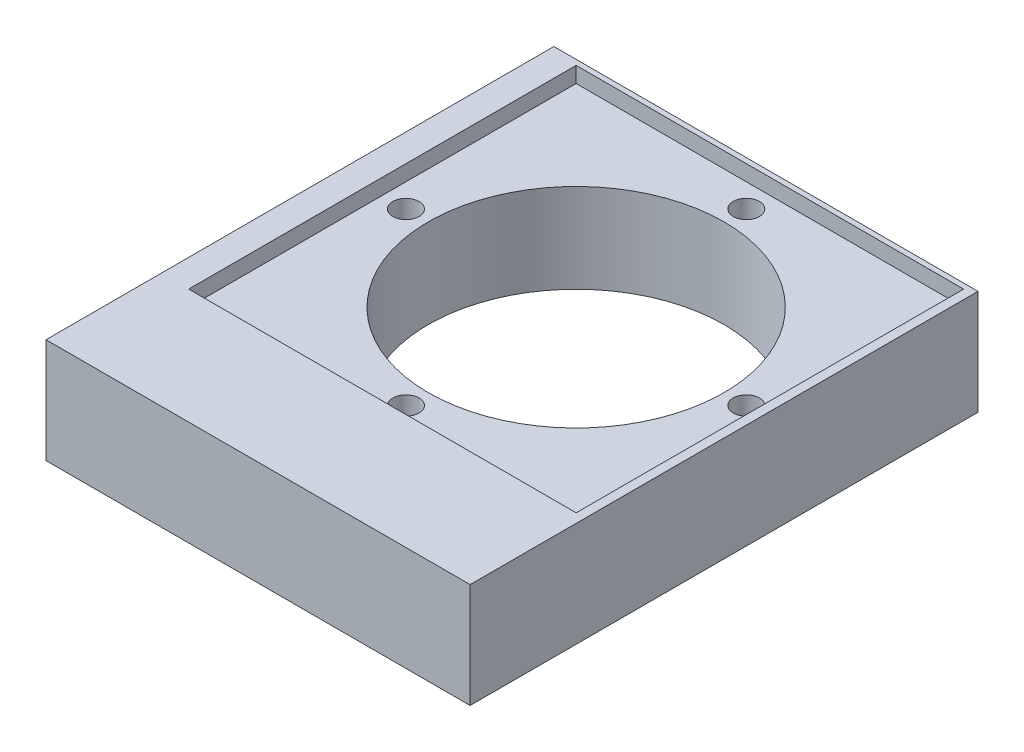
ISO-10303-21;
HEADER;
FILE_DESCRIPTION(('STEP AP214'),'2;1');
FILE_NAME('part.step','',(''),(''),'','','');
FILE_SCHEMA(('AUTOMOTIVE_DESIGN { 1 0 10303 214 1 1 1 1 }'));
ENDSEC;
DATA;
#1=APPLICATION_CONTEXT('core data for automotive mechanical design processes');
#2=APPLICATION_PROTOCOL_DEFINITION('international standard','automotive_design',2000,#1);
#3=PRODUCT_CONTEXT('',#1,'mechanical');
#4=PRODUCT('Part','Part','',(#3));
#5=PRODUCT_RELATED_PRODUCT_CATEGORY('part','',(#4));
#6=PRODUCT_DEFINITION_FORMATION('','',#4);
#7=PRODUCT_DEFINITION_CONTEXT('part definition',#1,'design');
#8=PRODUCT_DEFINITION('design','',#6,#7);
#9=PRODUCT_DEFINITION_SHAPE('','',#8);
#10=(LENGTH_UNIT() NAMED_UNIT(*) SI_UNIT(.MILLI.,.METRE.));
#11=(NAMED_UNIT(*) PLANE_ANGLE_UNIT() SI_UNIT($,.RADIAN.));
#12=(NAMED_UNIT(*) SI_UNIT($,.STERADIAN.) SOLID_ANGLE_UNIT());
#13=UNCERTAINTY_MEASURE_WITH_UNIT(LENGTH_MEASURE(1.E-05),#10,'distance_accuracy_value','');
#14=(GEOMETRIC_REPRESENTATION_CONTEXT(3) GLOBAL_UNCERTAINTY_ASSIGNED_CONTEXT((#13)) GLOBAL_UNIT_ASSIGNED_CONTEXT((#10,
#11,#12)) REPRESENTATION_CONTEXT('',''));
#15=CARTESIAN_POINT('',(0.,0.,0.));
#16=DIRECTION('',(0.,0.,1.));
#17=DIRECTION('',(1.,0.,0.));
#18=AXIS2_PLACEMENT_3D('',#15,#16,#17);
#19=CARTESIAN_POINT('',(1.75,0.,-10.5));
#20=DIRECTION('',(0.,1.,0.));
#21=DIRECTION('',(0.,0.,1.));
#22=AXIS2_PLACEMENT_3D('',#19,#20,#21);
#23=CYLINDRICAL_SURFACE('',#22,28.25);
#24=CARTESIAN_POINT('',(1.75,0.,-10.5));
#25=DIRECTION('',(0.,1.,0.));
#26=DIRECTION('',(0.,0.,1.));
#27=AXIS2_PLACEMENT_3D('',#24,#25,#26);
#28=CIRCLE('',#27,28.25);
#29=CARTESIAN_POINT('',(1.75,0.,17.75));
#30=VERTEX_POINT('',#29);
#31=EDGE_CURVE('E170',#30,#30,#28,.T.);
#32=ORIENTED_EDGE('',*,*,#31,.F.);
#33=EDGE_LOOP('',(#32));
#34=FACE_BOUND('',#33,.T.);
#35=CARTESIAN_POINT('',(1.75,17.,-10.5));
#36=DIRECTION('',(0.,1.,0.));
#37=DIRECTION('',(0.,0.,1.));
#38=AXIS2_PLACEMENT_3D('',#35,#36,#37);
#39=CIRCLE('',#38,28.25);
#40=CARTESIAN_POINT('',(1.75,17.,17.75));
#41=VERTEX_POINT('',#40);
#42=EDGE_CURVE('E43',#41,#41,#39,.F.);
#43=ORIENTED_EDGE('',*,*,#42,.F.);
#44=EDGE_LOOP('',(#43));
#45=FACE_BOUND('',#44,.T.);
#46=ADVANCED_FACE('F39',(#34,#45),#23,.F.);
#47=CARTESIAN_POINT('',(40.5,20.,-48.5));
#48=DIRECTION('',(-1.,0.,0.));
#49=DIRECTION('',(0.,0.,1.));
#50=AXIS2_PLACEMENT_3D('',#47,#48,#49);
#51=PLANE('',#50);
#52=DIRECTION('',(0.,0.,-1.));
#53=VECTOR('',#52,1.);
#54=CARTESIAN_POINT('',(40.5,0.,-48.5));
#55=LINE('',#54,#53);
#56=CARTESIAN_POINT('',(40.5,0.,48.5));
#57=VERTEX_POINT('',#56);
#58=CARTESIAN_POINT('',(40.5,0.,-48.5));
#59=VERTEX_POINT('',#58);
#60=EDGE_CURVE('E174',#57,#59,#55,.T.);
#61=ORIENTED_EDGE('',*,*,#60,.T.);
#62=DIRECTION('',(0.,-1.,0.));
#63=VECTOR('',#62,1.);
#64=CARTESIAN_POINT('',(40.5,20.,-48.5));
#65=LINE('',#64,#63);
#66=CARTESIAN_POINT('',(40.5,20.,-48.5));
#67=VERTEX_POINT('',#66);
#68=EDGE_CURVE('E11',#67,#59,#65,.T.);
#69=ORIENTED_EDGE('',*,*,#68,.F.);
#70=DIRECTION('',(0.,0.,-1.));
#71=VECTOR('',#70,1.);
#72=CARTESIAN_POINT('',(40.5,20.,-48.5));
#73=LINE('',#72,#71);
#74=CARTESIAN_POINT('',(40.5,20.,48.5));
#75=VERTEX_POINT('',#74);
#76=EDGE_CURVE('E175',#75,#67,#73,.T.);
#77=ORIENTED_EDGE('',*,*,#76,.F.);
#78=DIRECTION('',(0.,-1.,0.));
#79=VECTOR('',#78,1.);
#80=CARTESIAN_POINT('',(40.5,20.,48.5));
#81=LINE('',#80,#79);
#82=EDGE_CURVE('E185',#75,#57,#81,.T.);
#83=ORIENTED_EDGE('',*,*,#82,.T.);
#84=EDGE_LOOP('',(#61,#69,#77,#83));
#85=FACE_BOUND('',#84,.T.);
#86=ADVANCED_FACE('F41',(#85),#51,.F.);
#87=CARTESIAN_POINT('',(-40.5,20.,-48.5));
#88=DIRECTION('',(0.,0.,1.));
#89=DIRECTION('',(1.,0.,0.));
#90=AXIS2_PLACEMENT_3D('',#87,#88,#89);
#91=PLANE('',#90);
#92=DIRECTION('',(-1.,0.,0.));
#93=VECTOR('',#92,1.);
#94=CARTESIAN_POINT('',(-40.5,0.,-48.5));
#95=LINE('',#94,#93);
#96=CARTESIAN_POINT('',(-40.5,0.,-48.5));
#97=VERTEX_POINT('',#96);
#98=EDGE_CURVE('E189',#59,#97,#95,.T.);
#99=ORIENTED_EDGE('',*,*,#98,.T.);
#100=DIRECTION('',(0.,-1.,0.));
#101=VECTOR('',#100,1.);
#102=CARTESIAN_POINT('',(-40.5,20.,-48.5));
#103=LINE('',#102,#101);
#104=CARTESIAN_POINT('',(-40.5,20.,-48.5));
#105=VERTEX_POINT('',#104);
#106=EDGE_CURVE('E49',#105,#97,#103,.T.);
#107=ORIENTED_EDGE('',*,*,#106,.F.);
#108=DIRECTION('',(-1.,0.,0.));
#109=VECTOR('',#108,1.);
#110=CARTESIAN_POINT('',(-40.5,20.,-48.5));
#111=LINE('',#110,#109);
#112=EDGE_CURVE('E93',#67,#105,#111,.T.);
#113=ORIENTED_EDGE('',*,*,#112,.F.);
#114=ORIENTED_EDGE('',*,*,#68,.T.);
#115=EDGE_LOOP('',(#99,#107,#113,#114));
#116=FACE_BOUND('',#115,.T.);
#117=ADVANCED_FACE('F225',(#116),#91,.F.);
#118=CARTESIAN_POINT('',(-40.5,20.,-48.5));
#119=DIRECTION('',(1.,0.,0.));
#120=DIRECTION('',(0.,0.,-1.));
#121=AXIS2_PLACEMENT_3D('',#118,#119,#120);
#122=PLANE('',#121);
#123=DIRECTION('',(0.,0.,1.));
#124=VECTOR('',#123,1.);
#125=CARTESIAN_POINT('',(-40.5,0.,-48.5));
#126=LINE('',#125,#124);
#127=CARTESIAN_POINT('',(-40.5,0.,48.5));
#128=VERTEX_POINT('',#127);
#129=EDGE_CURVE('E192',#97,#128,#126,.T.);
#130=ORIENTED_EDGE('',*,*,#129,.T.);
#131=DIRECTION('',(0.,-1.,0.));
#132=VECTOR('',#131,1.);
#133=CARTESIAN_POINT('',(-40.5,20.,48.5));
#134=LINE('',#133,#132);
#135=CARTESIAN_POINT('',(-40.5,20.,48.5));
#136=VERTEX_POINT('',#135);
#137=EDGE_CURVE('E199',#136,#128,#134,.T.);
#138=ORIENTED_EDGE('',*,*,#137,.F.);
#139=DIRECTION('',(0.,0.,1.));
#140=VECTOR('',#139,1.);
#141=CARTESIAN_POINT('',(-40.5,20.,-48.5));
#142=LINE('',#141,#140);
#143=EDGE_CURVE('E180',#105,#136,#142,.T.);
#144=ORIENTED_EDGE('',*,*,#143,.F.);
#145=ORIENTED_EDGE('',*,*,#106,.T.);
#146=EDGE_LOOP('',(#130,#138,#144,#145));
#147=FACE_BOUND('',#146,.T.);
#148=ADVANCED_FACE('F207',(#147),#122,.F.);
#149=CARTESIAN_POINT('',(-40.5,20.,48.5));
#150=DIRECTION('',(0.,0.,-1.));
#151=DIRECTION('',(-1.,0.,0.));
#152=AXIS2_PLACEMENT_3D('',#149,#150,#151);
#153=PLANE('',#152);
#154=DIRECTION('',(1.,0.,0.));
#155=VECTOR('',#154,1.);
#156=CARTESIAN_POINT('',(-40.5,0.,48.5));
#157=LINE('',#156,#155);
#158=EDGE_CURVE('E86',#128,#57,#157,.T.);
#159=ORIENTED_EDGE('',*,*,#158,.T.);
#160=ORIENTED_EDGE('',*,*,#82,.F.);
#161=DIRECTION('',(1.,0.,0.));
#162=VECTOR('',#161,1.);
#163=CARTESIAN_POINT('',(-40.5,20.,48.5));
#164=LINE('',#163,#162);
#165=EDGE_CURVE('E65',#136,#75,#164,.T.);
#166=ORIENTED_EDGE('',*,*,#165,.F.);
#167=ORIENTED_EDGE('',*,*,#137,.T.);
#168=EDGE_LOOP('',(#159,#160,#166,#167));
#169=FACE_BOUND('',#168,.T.);
#170=ADVANCED_FACE('F215',(#169),#153,.F.);
#171=CARTESIAN_POINT('',(0.,20.,0.));
#172=DIRECTION('',(0.,1.,0.));
#173=DIRECTION('',(0.,0.,1.));
#174=AXIS2_PLACEMENT_3D('',#171,#172,#173);
#175=PLANE('',#174);
#176=DIRECTION('',(0.,0.,-1.));
#177=VECTOR('',#176,1.);
#178=CARTESIAN_POINT('',(38.75,20.,-47.5));
#179=LINE('',#178,#177);
#180=CARTESIAN_POINT('',(38.75,20.,26.5));
#181=VERTEX_POINT('',#180);
#182=CARTESIAN_POINT('',(38.75,20.,-47.5));
#183=VERTEX_POINT('',#182);
#184=EDGE_CURVE('E56',#181,#183,#179,.T.);
#185=ORIENTED_EDGE('',*,*,#184,.F.);
#186=DIRECTION('',(1.,0.,0.));
#187=VECTOR('',#186,1.);
#188=CARTESIAN_POINT('',(-35.25,20.,26.5));
#189=LINE('',#188,#187);
#190=CARTESIAN_POINT('',(-35.25,20.,26.5));
#191=VERTEX_POINT('',#190);
#192=EDGE_CURVE('E139',#191,#181,#189,.T.);
#193=ORIENTED_EDGE('',*,*,#192,.F.);
#194=DIRECTION('',(0.,0.,1.));
#195=VECTOR('',#194,1.);
#196=CARTESIAN_POINT('',(-35.25,20.,-47.5));
#197=LINE('',#196,#195);
#198=CARTESIAN_POINT('',(-35.25,20.,-47.5));
#199=VERTEX_POINT('',#198);
#200=EDGE_CURVE('E143',#199,#191,#197,.T.);
#201=ORIENTED_EDGE('',*,*,#200,.F.);
#202=DIRECTION('',(-1.,0.,0.));
#203=VECTOR('',#202,1.);
#204=CARTESIAN_POINT('',(-35.25,20.,-47.5));
#205=LINE('',#204,#203);
#206=EDGE_CURVE('E155',#183,#199,#205,.T.);
#207=ORIENTED_EDGE('',*,*,#206,.F.);
#208=EDGE_LOOP('',(#185,#193,#201,#207));
#209=FACE_BOUND('',#208,.T.);
#210=ORIENTED_EDGE('',*,*,#76,.T.);
#211=ORIENTED_EDGE('',*,*,#112,.T.);
#212=ORIENTED_EDGE('',*,*,#143,.T.);
#213=ORIENTED_EDGE('',*,*,#165,.T.);
#214=EDGE_LOOP('',(#210,#211,#212,#213));
#215=FACE_BOUND('',#214,.T.);
#216=ADVANCED_FACE('F217',(#209,#215),#175,.T.);
#217=CARTESIAN_POINT('',(0.,0.,0.));
#218=DIRECTION('',(0.,1.,0.));
#219=DIRECTION('',(0.,0.,1.));
#220=AXIS2_PLACEMENT_3D('',#217,#218,#219);
#221=PLANE('',#220);
#222=CARTESIAN_POINT('',(34.25,0.,-10.5));
#223=DIRECTION('',(0.,1.,0.));
#224=DIRECTION('',(0.,0.,1.));
#225=AXIS2_PLACEMENT_3D('',#222,#223,#224);
#226=CIRCLE('',#225,2.5);
#227=CARTESIAN_POINT('',(34.25,0.,-8.00000000000001));
#228=VERTEX_POINT('',#227);
#229=EDGE_CURVE('E156',#228,#228,#226,.T.);
#230=ORIENTED_EDGE('',*,*,#229,.T.);
#231=EDGE_LOOP('',(#230));
#232=FACE_BOUND('',#231,.T.);
#233=CARTESIAN_POINT('',(1.74999999999995,0.,-43.));
#234=DIRECTION('',(0.,1.,0.));
#235=DIRECTION('',(0.,0.,1.));
#236=AXIS2_PLACEMENT_3D('',#233,#234,#235);
#237=CIRCLE('',#236,2.5);
#238=CARTESIAN_POINT('',(1.74999999999995,0.,-40.5));
#239=VERTEX_POINT('',#238);
#240=EDGE_CURVE('E251',#239,#239,#237,.T.);
#241=ORIENTED_EDGE('',*,*,#240,.T.);
#242=EDGE_LOOP('',(#241));
#243=FACE_BOUND('',#242,.T.);
#244=CARTESIAN_POINT('',(-30.75,0.,-10.5));
#245=DIRECTION('',(0.,1.,0.));
#246=DIRECTION('',(0.,0.,1.));
#247=AXIS2_PLACEMENT_3D('',#244,#245,#246);
#248=CIRCLE('',#247,2.5);
#249=CARTESIAN_POINT('',(-30.75,0.,-8.00000000000001));
#250=VERTEX_POINT('',#249);
#251=EDGE_CURVE('E255',#250,#250,#248,.T.);
#252=ORIENTED_EDGE('',*,*,#251,.T.);
#253=EDGE_LOOP('',(#252));
#254=FACE_BOUND('',#253,.T.);
#255=CARTESIAN_POINT('',(1.74999999999995,0.,22.));
#256=DIRECTION('',(0.,1.,0.));
#257=DIRECTION('',(0.,0.,1.));
#258=AXIS2_PLACEMENT_3D('',#255,#256,#257);
#259=CIRCLE('',#258,2.5);
#260=CARTESIAN_POINT('',(1.74999999999995,0.,24.5));
#261=VERTEX_POINT('',#260);
#262=EDGE_CURVE('E146',#261,#261,#259,.T.);
#263=ORIENTED_EDGE('',*,*,#262,.T.);
#264=EDGE_LOOP('',(#263));
#265=FACE_BOUND('',#264,.T.);
#266=ORIENTED_EDGE('',*,*,#31,.T.);
#267=EDGE_LOOP('',(#266));
#268=FACE_BOUND('',#267,.T.);
#269=ORIENTED_EDGE('',*,*,#60,.F.);
#270=ORIENTED_EDGE('',*,*,#158,.F.);
#271=ORIENTED_EDGE('',*,*,#129,.F.);
#272=ORIENTED_EDGE('',*,*,#98,.F.);
#273=EDGE_LOOP('',(#269,#270,#271,#272));
#274=FACE_BOUND('',#273,.T.);
#275=ADVANCED_FACE('F211',(#232,#243,#254,#265,#268,#274),#221,.F.);
#276=CARTESIAN_POINT('',(0.,17.,0.));
#277=DIRECTION('',(0.,1.,0.));
#278=DIRECTION('',(0.,0.,1.));
#279=AXIS2_PLACEMENT_3D('',#276,#277,#278);
#280=PLANE('',#279);
#281=CARTESIAN_POINT('',(34.25,17.,-10.5));
#282=DIRECTION('',(0.,1.,0.));
#283=DIRECTION('',(0.,0.,1.));
#284=AXIS2_PLACEMENT_3D('',#281,#282,#283);
#285=CIRCLE('',#284,2.5);
#286=CARTESIAN_POINT('',(34.25,17.,-8.00000000000001));
#287=VERTEX_POINT('',#286);
#288=EDGE_CURVE('E279',#287,#287,#285,.T.);
#289=ORIENTED_EDGE('',*,*,#288,.F.);
#290=EDGE_LOOP('',(#289));
#291=FACE_BOUND('',#290,.T.);
#292=CARTESIAN_POINT('',(1.74999999999995,17.,-43.));
#293=DIRECTION('',(0.,1.,0.));
#294=DIRECTION('',(0.,0.,1.));
#295=AXIS2_PLACEMENT_3D('',#292,#293,#294);
#296=CIRCLE('',#295,2.5);
#297=CARTESIAN_POINT('',(1.74999999999995,17.,-40.5));
#298=VERTEX_POINT('',#297);
#299=EDGE_CURVE('E275',#298,#298,#296,.T.);
#300=ORIENTED_EDGE('',*,*,#299,.F.);
#301=EDGE_LOOP('',(#300));
#302=FACE_BOUND('',#301,.T.);
#303=CARTESIAN_POINT('',(-30.75,17.,-10.5));
#304=DIRECTION('',(0.,1.,0.));
#305=DIRECTION('',(0.,0.,1.));
#306=AXIS2_PLACEMENT_3D('',#303,#304,#305);
#307=CIRCLE('',#306,2.5);
#308=CARTESIAN_POINT('',(-30.75,17.,-8.00000000000001));
#309=VERTEX_POINT('',#308);
#310=EDGE_CURVE('E267',#309,#309,#307,.T.);
#311=ORIENTED_EDGE('',*,*,#310,.F.);
#312=EDGE_LOOP('',(#311));
#313=FACE_BOUND('',#312,.T.);
#314=CARTESIAN_POINT('',(1.74999999999995,17.,22.));
#315=DIRECTION('',(0.,1.,0.));
#316=DIRECTION('',(0.,0.,1.));
#317=AXIS2_PLACEMENT_3D('',#314,#315,#316);
#318=CIRCLE('',#317,2.5);
#319=CARTESIAN_POINT('',(1.74999999999995,17.,24.5));
#320=VERTEX_POINT('',#319);
#321=EDGE_CURVE('E261',#320,#320,#318,.T.);
#322=ORIENTED_EDGE('',*,*,#321,.F.);
#323=EDGE_LOOP('',(#322));
#324=FACE_BOUND('',#323,.T.);
#325=DIRECTION('',(0.,0.,-1.));
#326=VECTOR('',#325,1.);
#327=CARTESIAN_POINT('',(38.75,17.,-47.5));
#328=LINE('',#327,#326);
#329=CARTESIAN_POINT('',(38.75,17.,26.5));
#330=VERTEX_POINT('',#329);
#331=CARTESIAN_POINT('',(38.75,17.,-47.5));
#332=VERTEX_POINT('',#331);
#333=EDGE_CURVE('E117',#330,#332,#328,.T.);
#334=ORIENTED_EDGE('',*,*,#333,.T.);
#335=DIRECTION('',(-1.,0.,0.));
#336=VECTOR('',#335,1.);
#337=CARTESIAN_POINT('',(-35.25,17.,-47.5));
#338=LINE('',#337,#336);
#339=CARTESIAN_POINT('',(-35.25,17.,-47.5));
#340=VERTEX_POINT('',#339);
#341=EDGE_CURVE('E127',#332,#340,#338,.T.);
#342=ORIENTED_EDGE('',*,*,#341,.T.);
#343=DIRECTION('',(0.,0.,1.));
#344=VECTOR('',#343,1.);
#345=CARTESIAN_POINT('',(-35.25,17.,-47.5));
#346=LINE('',#345,#344);
#347=CARTESIAN_POINT('',(-35.25,17.,26.5));
#348=VERTEX_POINT('',#347);
#349=EDGE_CURVE('E133',#340,#348,#346,.T.);
#350=ORIENTED_EDGE('',*,*,#349,.T.);
#351=DIRECTION('',(1.,0.,0.));
#352=VECTOR('',#351,1.);
#353=CARTESIAN_POINT('',(-35.25,17.,26.5));
#354=LINE('',#353,#352);
#355=EDGE_CURVE('E124',#348,#330,#354,.T.);
#356=ORIENTED_EDGE('',*,*,#355,.T.);
#357=EDGE_LOOP('',(#334,#342,#350,#356));
#358=FACE_BOUND('',#357,.T.);
#359=ORIENTED_EDGE('',*,*,#42,.T.);
#360=EDGE_LOOP('',(#359));
#361=FACE_BOUND('',#360,.T.);
#362=ADVANCED_FACE('F135',(#291,#302,#313,#324,#358,#361),#280,.T.);
#363=CARTESIAN_POINT('',(38.75,17.,-47.5));
#364=DIRECTION('',(1.,0.,0.));
#365=DIRECTION('',(0.,0.,-1.));
#366=AXIS2_PLACEMENT_3D('',#363,#364,#365);
#367=PLANE('',#366);
#368=ORIENTED_EDGE('',*,*,#184,.T.);
#369=DIRECTION('',(0.,1.,0.));
#370=VECTOR('',#369,1.);
#371=CARTESIAN_POINT('',(38.75,17.,-47.5));
#372=LINE('',#371,#370);
#373=EDGE_CURVE('E113',#332,#183,#372,.T.);
#374=ORIENTED_EDGE('',*,*,#373,.F.);
#375=ORIENTED_EDGE('',*,*,#333,.F.);
#376=DIRECTION('',(0.,1.,0.));
#377=VECTOR('',#376,1.);
#378=CARTESIAN_POINT('',(38.75,17.,26.5));
#379=LINE('',#378,#377);
#380=EDGE_CURVE('E162',#330,#181,#379,.T.);
#381=ORIENTED_EDGE('',*,*,#380,.T.);
#382=EDGE_LOOP('',(#368,#374,#375,#381));
#383=FACE_BOUND('',#382,.T.);
#384=ADVANCED_FACE('F115',(#383),#367,.F.);
#385=CARTESIAN_POINT('',(-35.25,17.,26.5));
#386=DIRECTION('',(0.,0.,1.));
#387=DIRECTION('',(1.,0.,0.));
#388=AXIS2_PLACEMENT_3D('',#385,#386,#387);
#389=PLANE('',#388);
#390=ORIENTED_EDGE('',*,*,#192,.T.);
#391=ORIENTED_EDGE('',*,*,#380,.F.);
#392=ORIENTED_EDGE('',*,*,#355,.F.);
#393=DIRECTION('',(0.,1.,0.));
#394=VECTOR('',#393,1.);
#395=CARTESIAN_POINT('',(-35.25,17.,26.5));
#396=LINE('',#395,#394);
#397=EDGE_CURVE('E165',#348,#191,#396,.T.);
#398=ORIENTED_EDGE('',*,*,#397,.T.);
#399=EDGE_LOOP('',(#390,#391,#392,#398));
#400=FACE_BOUND('',#399,.T.);
#401=ADVANCED_FACE('F308',(#400),#389,.F.);
#402=CARTESIAN_POINT('',(-35.25,17.,-47.5));
#403=DIRECTION('',(-1.,0.,0.));
#404=DIRECTION('',(0.,0.,1.));
#405=AXIS2_PLACEMENT_3D('',#402,#403,#404);
#406=PLANE('',#405);
#407=ORIENTED_EDGE('',*,*,#200,.T.);
#408=ORIENTED_EDGE('',*,*,#397,.F.);
#409=ORIENTED_EDGE('',*,*,#349,.F.);
#410=DIRECTION('',(0.,1.,0.));
#411=VECTOR('',#410,1.);
#412=CARTESIAN_POINT('',(-35.25,17.,-47.5));
#413=LINE('',#412,#411);
#414=EDGE_CURVE('E123',#340,#199,#413,.T.);
#415=ORIENTED_EDGE('',*,*,#414,.T.);
#416=EDGE_LOOP('',(#407,#408,#409,#415));
#417=FACE_BOUND('',#416,.T.);
#418=ADVANCED_FACE('F311',(#417),#406,.F.);
#419=CARTESIAN_POINT('',(-35.25,17.,-47.5));
#420=DIRECTION('',(0.,0.,-1.));
#421=DIRECTION('',(-1.,0.,0.));
#422=AXIS2_PLACEMENT_3D('',#419,#420,#421);
#423=PLANE('',#422);
#424=ORIENTED_EDGE('',*,*,#206,.T.);
#425=ORIENTED_EDGE('',*,*,#414,.F.);
#426=ORIENTED_EDGE('',*,*,#341,.F.);
#427=ORIENTED_EDGE('',*,*,#373,.T.);
#428=EDGE_LOOP('',(#424,#425,#426,#427));
#429=FACE_BOUND('',#428,.T.);
#430=ADVANCED_FACE('F128',(#429),#423,.F.);
#431=CARTESIAN_POINT('',(1.74999999999995,0.,22.));
#432=DIRECTION('',(0.,1.,0.));
#433=DIRECTION('',(0.,0.,1.));
#434=AXIS2_PLACEMENT_3D('',#431,#432,#433);
#435=CYLINDRICAL_SURFACE('',#434,2.5);
#436=ORIENTED_EDGE('',*,*,#262,.F.);
#437=EDGE_LOOP('',(#436));
#438=FACE_BOUND('',#437,.T.);
#439=ORIENTED_EDGE('',*,*,#321,.T.);
#440=EDGE_LOOP('',(#439));
#441=FACE_BOUND('',#440,.T.);
#442=ADVANCED_FACE('F296',(#438,#441),#435,.F.);
#443=CARTESIAN_POINT('',(-30.75,0.,-10.5));
#444=DIRECTION('',(0.,1.,0.));
#445=DIRECTION('',(0.,0.,1.));
#446=AXIS2_PLACEMENT_3D('',#443,#444,#445);
#447=CYLINDRICAL_SURFACE('',#446,2.5);
#448=ORIENTED_EDGE('',*,*,#251,.F.);
#449=EDGE_LOOP('',(#448));
#450=FACE_BOUND('',#449,.T.);
#451=ORIENTED_EDGE('',*,*,#310,.T.);
#452=EDGE_LOOP('',(#451));
#453=FACE_BOUND('',#452,.T.);
#454=ADVANCED_FACE('F293',(#450,#453),#447,.F.);
#455=CARTESIAN_POINT('',(1.74999999999995,0.,-43.));
#456=DIRECTION('',(0.,1.,0.));
#457=DIRECTION('',(0.,0.,1.));
#458=AXIS2_PLACEMENT_3D('',#455,#456,#457);
#459=CYLINDRICAL_SURFACE('',#458,2.5);
#460=ORIENTED_EDGE('',*,*,#240,.F.);
#461=EDGE_LOOP('',(#460));
#462=FACE_BOUND('',#461,.T.);
#463=ORIENTED_EDGE('',*,*,#299,.T.);
#464=EDGE_LOOP('',(#463));
#465=FACE_BOUND('',#464,.T.);
#466=ADVANCED_FACE('F295',(#462,#465),#459,.F.);
#467=CARTESIAN_POINT('',(34.25,0.,-10.5));
#468=DIRECTION('',(0.,1.,0.));
#469=DIRECTION('',(0.,0.,1.));
#470=AXIS2_PLACEMENT_3D('',#467,#468,#469);
#471=CYLINDRICAL_SURFACE('',#470,2.5);
#472=ORIENTED_EDGE('',*,*,#229,.F.);
#473=EDGE_LOOP('',(#472));
#474=FACE_BOUND('',#473,.T.);
#475=ORIENTED_EDGE('',*,*,#288,.T.);
#476=EDGE_LOOP('',(#475));
#477=FACE_BOUND('',#476,.T.);
#478=ADVANCED_FACE('F286',(#474,#477),#471,.F.);
#479=CLOSED_SHELL('',(#46,#86,#117,#148,#170,#216,#275,#362,#384,#401,#418,#430,#442,#454,#466,#478));
#480=MANIFOLD_SOLID_BREP('B2',#479);
#481=ADVANCED_BREP_SHAPE_REPRESENTATION('',(#18,#480),#14);
#482=SHAPE_DEFINITION_REPRESENTATION(#9,#481);
ENDSEC;
END-ISO-10303-21;
